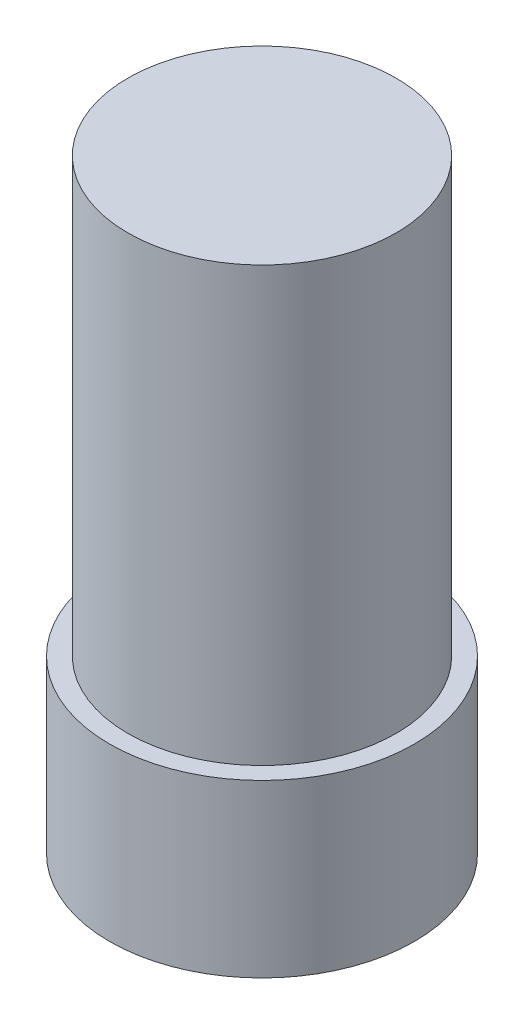
ISO-10303-21;
HEADER;
FILE_DESCRIPTION(('STEP AP214'),'2;1');
FILE_NAME('part.step','',(''),(''),'','','');
FILE_SCHEMA(('AUTOMOTIVE_DESIGN { 1 0 10303 214 1 1 1 1 }'));
ENDSEC;
DATA;
#1=APPLICATION_CONTEXT('core data for automotive mechanical design processes');
#2=APPLICATION_PROTOCOL_DEFINITION('international standard','automotive_design',2000,#1);
#3=PRODUCT_CONTEXT('',#1,'mechanical');
#4=PRODUCT('Part','Part','',(#3));
#5=PRODUCT_RELATED_PRODUCT_CATEGORY('part','',(#4));
#6=PRODUCT_DEFINITION_FORMATION('','',#4);
#7=PRODUCT_DEFINITION_CONTEXT('part definition',#1,'design');
#8=PRODUCT_DEFINITION('design','',#6,#7);
#9=PRODUCT_DEFINITION_SHAPE('','',#8);
#10=(LENGTH_UNIT() NAMED_UNIT(*) SI_UNIT(.MILLI.,.METRE.));
#11=(NAMED_UNIT(*) PLANE_ANGLE_UNIT() SI_UNIT($,.RADIAN.));
#12=(NAMED_UNIT(*) SI_UNIT($,.STERADIAN.) SOLID_ANGLE_UNIT());
#13=UNCERTAINTY_MEASURE_WITH_UNIT(LENGTH_MEASURE(1.E-05),#10,'distance_accuracy_value','');
#14=(GEOMETRIC_REPRESENTATION_CONTEXT(3) GLOBAL_UNCERTAINTY_ASSIGNED_CONTEXT((#13)) GLOBAL_UNIT_ASSIGNED_CONTEXT((#10,
#11,#12)) REPRESENTATION_CONTEXT('',''));
#15=CARTESIAN_POINT('',(0.,0.,0.));
#16=DIRECTION('',(0.,0.,1.));
#17=DIRECTION('',(1.,0.,0.));
#18=AXIS2_PLACEMENT_3D('',#15,#16,#17);
#19=CARTESIAN_POINT('',(0.,22.,0.));
#20=DIRECTION('',(0.,-1.,0.));
#21=DIRECTION('',(0.,0.,-1.));
#22=AXIS2_PLACEMENT_3D('',#19,#20,#21);
#23=CYLINDRICAL_SURFACE('',#22,12.25);
#24=CARTESIAN_POINT('',(0.,0.,0.));
#25=DIRECTION('',(0.,1.,0.));
#26=DIRECTION('',(0.,0.,1.));
#27=AXIS2_PLACEMENT_3D('',#24,#25,#26);
#28=CIRCLE('',#27,12.25);
#29=CARTESIAN_POINT('',(0.,0.,12.25));
#30=VERTEX_POINT('',#29);
#31=EDGE_CURVE('E47',#30,#30,#28,.T.);
#32=ORIENTED_EDGE('',*,*,#31,.F.);
#33=EDGE_LOOP('',(#32));
#34=FACE_BOUND('',#33,.T.);
#35=CARTESIAN_POINT('',(0.,9.,0.));
#36=DIRECTION('',(0.,1.,0.));
#37=DIRECTION('',(0.,0.,1.));
#38=AXIS2_PLACEMENT_3D('',#35,#36,#37);
#39=CIRCLE('',#38,12.25);
#40=CARTESIAN_POINT('',(0.,9.,12.25));
#41=VERTEX_POINT('',#40);
#42=EDGE_CURVE('E51',#41,#41,#39,.T.);
#43=ORIENTED_EDGE('',*,*,#42,.T.);
#44=EDGE_LOOP('',(#43));
#45=FACE_BOUND('',#44,.T.);
#46=ADVANCED_FACE('F31',(#34,#45),#23,.F.);
#47=CARTESIAN_POINT('',(0.,22.,0.));
#48=DIRECTION('',(0.,1.,0.));
#49=DIRECTION('',(0.,0.,1.));
#50=AXIS2_PLACEMENT_3D('',#47,#48,#49);
#51=PLANE('',#50);
#52=CARTESIAN_POINT('',(0.,22.,0.));
#53=DIRECTION('',(0.,1.,0.));
#54=DIRECTION('',(0.,0.,1.));
#55=AXIS2_PLACEMENT_3D('',#52,#53,#54);
#56=CIRCLE('',#55,17.25);
#57=CARTESIAN_POINT('',(0.,22.,17.25));
#58=VERTEX_POINT('',#57);
#59=EDGE_CURVE('E10',#58,#58,#56,.T.);
#60=ORIENTED_EDGE('',*,*,#59,.F.);
#61=EDGE_LOOP('',(#60));
#62=FACE_BOUND('',#61,.T.);
#63=CARTESIAN_POINT('',(0.,22.,0.));
#64=DIRECTION('',(0.,1.,0.));
#65=DIRECTION('',(0.,0.,1.));
#66=AXIS2_PLACEMENT_3D('',#63,#64,#65);
#67=CIRCLE('',#66,19.6);
#68=CARTESIAN_POINT('',(0.,22.,19.6));
#69=VERTEX_POINT('',#68);
#70=EDGE_CURVE('E38',#69,#69,#67,.T.);
#71=ORIENTED_EDGE('',*,*,#70,.T.);
#72=EDGE_LOOP('',(#71));
#73=FACE_BOUND('',#72,.T.);
#74=ADVANCED_FACE('F75',(#62,#73),#51,.T.);
#75=CARTESIAN_POINT('',(0.,0.,0.));
#76=DIRECTION('',(0.,1.,0.));
#77=DIRECTION('',(0.,0.,1.));
#78=AXIS2_PLACEMENT_3D('',#75,#76,#77);
#79=PLANE('',#78);
#80=CARTESIAN_POINT('',(0.,0.,0.));
#81=DIRECTION('',(0.,1.,0.));
#82=DIRECTION('',(0.,0.,1.));
#83=AXIS2_PLACEMENT_3D('',#80,#81,#82);
#84=CIRCLE('',#83,19.6);
#85=CARTESIAN_POINT('',(0.,0.,19.6));
#86=VERTEX_POINT('',#85);
#87=EDGE_CURVE('E42',#86,#86,#84,.T.);
#88=ORIENTED_EDGE('',*,*,#87,.F.);
#89=EDGE_LOOP('',(#88));
#90=FACE_BOUND('',#89,.T.);
#91=ORIENTED_EDGE('',*,*,#31,.T.);
#92=EDGE_LOOP('',(#91));
#93=FACE_BOUND('',#92,.T.);
#94=ADVANCED_FACE('F80',(#90,#93),#79,.F.);
#95=CARTESIAN_POINT('',(0.,22.,0.));
#96=DIRECTION('',(0.,-1.,0.));
#97=DIRECTION('',(0.,0.,-1.));
#98=AXIS2_PLACEMENT_3D('',#95,#96,#97);
#99=CYLINDRICAL_SURFACE('',#98,19.6);
#100=ORIENTED_EDGE('',*,*,#70,.F.);
#101=EDGE_LOOP('',(#100));
#102=FACE_BOUND('',#101,.T.);
#103=ORIENTED_EDGE('',*,*,#87,.T.);
#104=EDGE_LOOP('',(#103));
#105=FACE_BOUND('',#104,.T.);
#106=ADVANCED_FACE('F33',(#102,#105),#99,.T.);
#107=CARTESIAN_POINT('',(0.,9.,0.));
#108=DIRECTION('',(0.,1.,0.));
#109=DIRECTION('',(0.,0.,1.));
#110=AXIS2_PLACEMENT_3D('',#107,#108,#109);
#111=PLANE('',#110);
#112=ORIENTED_EDGE('',*,*,#42,.F.);
#113=EDGE_LOOP('',(#112));
#114=FACE_BOUND('',#113,.T.);
#115=ADVANCED_FACE('F64',(#114),#111,.F.);
#116=CARTESIAN_POINT('',(0.,9.,0.));
#117=DIRECTION('',(0.,1.,0.));
#118=DIRECTION('',(0.,0.,1.));
#119=AXIS2_PLACEMENT_3D('',#116,#117,#118);
#120=CYLINDRICAL_SURFACE('',#119,17.25);
#121=CARTESIAN_POINT('',(0.,77.75,0.));
#122=DIRECTION('',(0.,1.,0.));
#123=DIRECTION('',(0.,0.,1.));
#124=AXIS2_PLACEMENT_3D('',#121,#122,#123);
#125=CIRCLE('',#124,17.25);
#126=CARTESIAN_POINT('',(0.,77.75,17.25));
#127=VERTEX_POINT('',#126);
#128=EDGE_CURVE('E53',#127,#127,#125,.T.);
#129=CARTESIAN_POINT('',(0.,22.,17.25));
#130=CARTESIAN_POINT('',(0.,22.5807291666667,17.25));
#131=CARTESIAN_POINT('',(0.,23.1614583333333,17.25));
#132=CARTESIAN_POINT('',(0.,24.3229166666667,17.25));
#133=CARTESIAN_POINT('',(0.,24.9036458333333,17.25));
#134=CARTESIAN_POINT('',(0.,26.0651041666667,17.25));
#135=CARTESIAN_POINT('',(0.,26.6458333333333,17.25));
#136=CARTESIAN_POINT('',(0.,27.8072916666667,17.25));
#137=CARTESIAN_POINT('',(0.,28.3880208333333,17.25));
#138=CARTESIAN_POINT('',(0.,29.5494791666667,17.25));
#139=CARTESIAN_POINT('',(0.,30.1302083333333,17.25));
#140=CARTESIAN_POINT('',(0.,31.2916666666667,17.25));
#141=CARTESIAN_POINT('',(0.,31.8723958333333,17.25));
#142=CARTESIAN_POINT('',(0.,33.0338541666667,17.25));
#143=CARTESIAN_POINT('',(0.,33.6145833333333,17.25));
#144=CARTESIAN_POINT('',(0.,34.7760416666667,17.25));
#145=CARTESIAN_POINT('',(0.,35.3567708333333,17.25));
#146=CARTESIAN_POINT('',(0.,36.5182291666667,17.25));
#147=CARTESIAN_POINT('',(0.,37.0989583333333,17.25));
#148=CARTESIAN_POINT('',(0.,38.2604166666667,17.25));
#149=CARTESIAN_POINT('',(0.,38.8411458333333,17.25));
#150=CARTESIAN_POINT('',(0.,40.0026041666667,17.25));
#151=CARTESIAN_POINT('',(0.,40.5833333333333,17.25));
#152=CARTESIAN_POINT('',(0.,41.7447916666667,17.25));
#153=CARTESIAN_POINT('',(0.,42.3255208333333,17.25));
#154=CARTESIAN_POINT('',(0.,43.4869791666667,17.25));
#155=CARTESIAN_POINT('',(0.,44.0677083333333,17.25));
#156=CARTESIAN_POINT('',(0.,45.2291666666667,17.25));
#157=CARTESIAN_POINT('',(0.,45.8098958333333,17.25));
#158=CARTESIAN_POINT('',(0.,46.9713541666667,17.25));
#159=CARTESIAN_POINT('',(0.,47.5520833333333,17.25));
#160=CARTESIAN_POINT('',(0.,48.7135416666667,17.25));
#161=CARTESIAN_POINT('',(0.,49.2942708333333,17.25));
#162=CARTESIAN_POINT('',(0.,50.4557291666667,17.25));
#163=CARTESIAN_POINT('',(0.,51.0364583333333,17.25));
#164=CARTESIAN_POINT('',(0.,52.1979166666667,17.25));
#165=CARTESIAN_POINT('',(0.,52.7786458333333,17.25));
#166=CARTESIAN_POINT('',(0.,53.9401041666667,17.25));
#167=CARTESIAN_POINT('',(0.,54.5208333333333,17.25));
#168=CARTESIAN_POINT('',(0.,55.6822916666667,17.25));
#169=CARTESIAN_POINT('',(0.,56.2630208333333,17.25));
#170=CARTESIAN_POINT('',(0.,57.4244791666667,17.25));
#171=CARTESIAN_POINT('',(0.,58.0052083333333,17.25));
#172=CARTESIAN_POINT('',(0.,59.1666666666667,17.25));
#173=CARTESIAN_POINT('',(0.,59.7473958333333,17.25));
#174=CARTESIAN_POINT('',(0.,60.9088541666667,17.25));
#175=CARTESIAN_POINT('',(0.,61.4895833333333,17.25));
#176=CARTESIAN_POINT('',(0.,62.6510416666667,17.25));
#177=CARTESIAN_POINT('',(0.,63.2317708333333,17.25));
#178=CARTESIAN_POINT('',(0.,64.3932291666667,17.25));
#179=CARTESIAN_POINT('',(0.,64.9739583333333,17.25));
#180=CARTESIAN_POINT('',(0.,66.1354166666667,17.25));
#181=CARTESIAN_POINT('',(0.,66.7161458333333,17.25));
#182=CARTESIAN_POINT('',(0.,67.8776041666667,17.25));
#183=CARTESIAN_POINT('',(0.,68.4583333333333,17.25));
#184=CARTESIAN_POINT('',(0.,69.6197916666667,17.25));
#185=CARTESIAN_POINT('',(0.,70.2005208333333,17.25));
#186=CARTESIAN_POINT('',(0.,71.3619791666667,17.25));
#187=CARTESIAN_POINT('',(0.,71.9427083333333,17.25));
#188=CARTESIAN_POINT('',(0.,73.1041666666667,17.25));
#189=CARTESIAN_POINT('',(0.,73.6848958333333,17.25));
#190=CARTESIAN_POINT('',(0.,74.8463541666667,17.25));
#191=CARTESIAN_POINT('',(0.,75.4270833333333,17.25));
#192=CARTESIAN_POINT('',(0.,76.5885416666667,17.25));
#193=CARTESIAN_POINT('',(0.,77.1692708333333,17.25));
#194=CARTESIAN_POINT('',(0.,77.75,17.25));
#195=B_SPLINE_CURVE_WITH_KNOTS('',3,(#129,#130,#131,#132,#133,#134,#135,#136,#137,#138,#139,
#140,#141,#142,#143,#144,#145,#146,#147,#148,#149,#150,#151,#152,#153,#154,#155,#156,#157,#158,
#159,#160,#161,#162,#163,#164,#165,#166,#167,#168,#169,#170,#171,#172,#173,#174,#175,#176,#177,
#178,#179,#180,#181,#182,#183,#184,#185,#186,#187,#188,#189,#190,#191,#192,#193,#194),
.UNSPECIFIED.,.F.,.F.,(4,2,2,2,2,2,2,2,2,2,2,2,2,2,2,2,2,2,2,2,2,2,2,2,2,2,2,2,2,2,2,2,4),(0.,
1.7421875,3.484375,5.2265625,6.96875,8.7109375,10.453125,12.1953125,13.9375,15.6796875,
17.421875,19.1640625,20.90625,22.6484375,24.390625,26.1328125,27.875,29.6171875,31.359375,
33.1015625,34.84375,36.5859375,38.328125,40.0703125,41.8125,43.5546875,45.296875,47.0390625,
48.78125,50.5234375,52.265625,54.0078125,55.75),.UNSPECIFIED.);
#196=EDGE_CURVE('BSEAM62',#58,#127,#195,.T.);
#197=ORIENTED_EDGE('',*,*,#59,.T.);
#198=ORIENTED_EDGE('',*,*,#128,.F.);
#199=ORIENTED_EDGE('',*,*,#196,.T.);
#200=ORIENTED_EDGE('',*,*,#196,.F.);
#201=EDGE_LOOP('',(#197,#199,#198,#200));
#202=FACE_BOUND('',#201,.T.);
#203=ADVANCED_FACE('F62',(#202),#120,.T.);
#204=CARTESIAN_POINT('',(0.,77.75,0.));
#205=DIRECTION('',(0.,1.,0.));
#206=DIRECTION('',(0.,0.,1.));
#207=AXIS2_PLACEMENT_3D('',#204,#205,#206);
#208=PLANE('',#207);
#209=ORIENTED_EDGE('',*,*,#128,.T.);
#210=EDGE_LOOP('',(#209));
#211=FACE_BOUND('',#210,.T.);
#212=ADVANCED_FACE('F60',(#211),#208,.T.);
#213=CLOSED_SHELL('',(#46,#74,#94,#106,#115,#203,#212));
#214=MANIFOLD_SOLID_BREP('B2',#213);
#215=ADVANCED_BREP_SHAPE_REPRESENTATION('',(#18,#214),#14);
#216=SHAPE_DEFINITION_REPRESENTATION(#9,#215);
ENDSEC;
END-ISO-10303-21;
